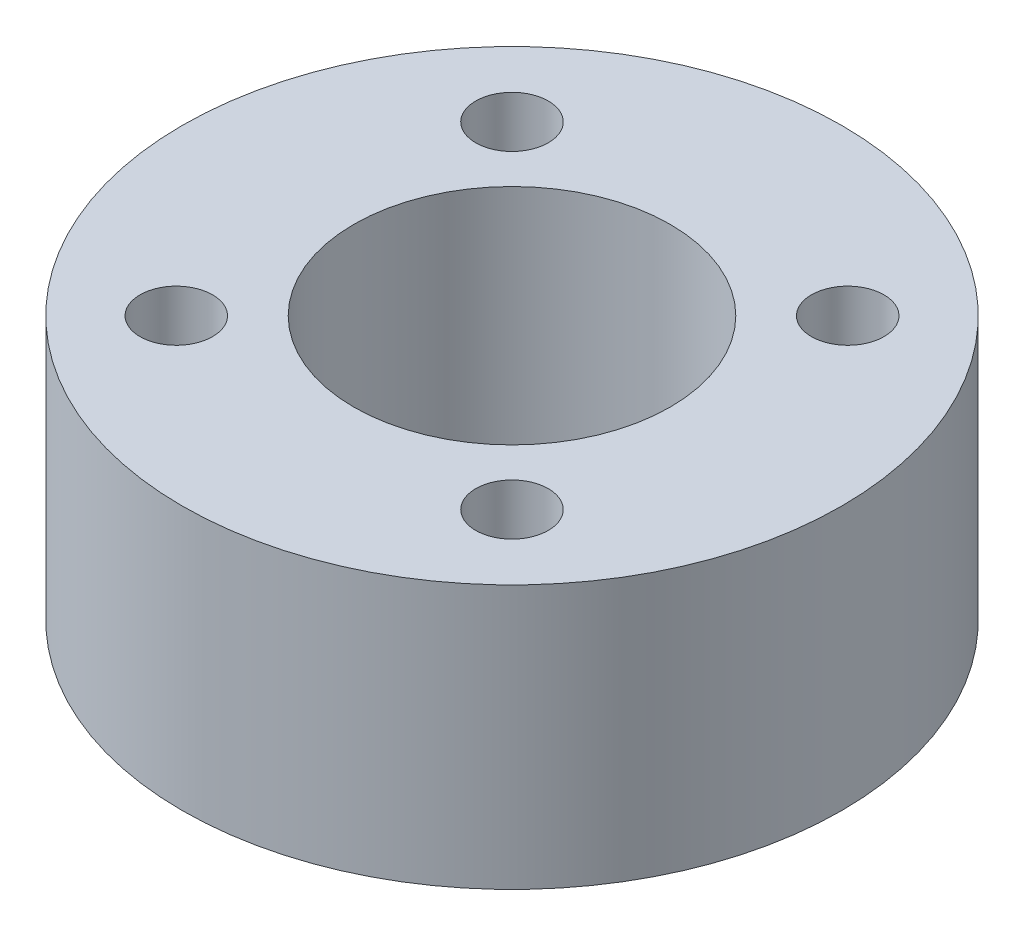
ISO-10303-21;
HEADER;
FILE_DESCRIPTION(('STEP AP214'),'2;1');
FILE_NAME('part.step','',(''),(''),'','','');
FILE_SCHEMA(('AUTOMOTIVE_DESIGN { 1 0 10303 214 1 1 1 1 }'));
ENDSEC;
DATA;
#1=APPLICATION_CONTEXT('core data for automotive mechanical design processes');
#2=APPLICATION_PROTOCOL_DEFINITION('international standard','automotive_design',2000,#1);
#3=PRODUCT_CONTEXT('',#1,'mechanical');
#4=PRODUCT('Part','Part','',(#3));
#5=PRODUCT_RELATED_PRODUCT_CATEGORY('part','',(#4));
#6=PRODUCT_DEFINITION_FORMATION('','',#4);
#7=PRODUCT_DEFINITION_CONTEXT('part definition',#1,'design');
#8=PRODUCT_DEFINITION('design','',#6,#7);
#9=PRODUCT_DEFINITION_SHAPE('','',#8);
#10=(LENGTH_UNIT() NAMED_UNIT(*) SI_UNIT(.MILLI.,.METRE.));
#11=(NAMED_UNIT(*) PLANE_ANGLE_UNIT() SI_UNIT($,.RADIAN.));
#12=(NAMED_UNIT(*) SI_UNIT($,.STERADIAN.) SOLID_ANGLE_UNIT());
#13=UNCERTAINTY_MEASURE_WITH_UNIT(LENGTH_MEASURE(1.E-05),#10,'distance_accuracy_value','');
#14=(GEOMETRIC_REPRESENTATION_CONTEXT(3) GLOBAL_UNCERTAINTY_ASSIGNED_CONTEXT((#13)) GLOBAL_UNIT_ASSIGNED_CONTEXT((#10,
#11,#12)) REPRESENTATION_CONTEXT('',''));
#15=CARTESIAN_POINT('',(0.,0.,0.));
#16=DIRECTION('',(0.,0.,1.));
#17=DIRECTION('',(1.,0.,0.));
#18=AXIS2_PLACEMENT_3D('',#15,#16,#17);
#19=CARTESIAN_POINT('',(0.,20.,0.));
#20=DIRECTION('',(0.,-1.,0.));
#21=DIRECTION('',(0.,0.,-1.));
#22=AXIS2_PLACEMENT_3D('',#19,#20,#21);
#23=CYLINDRICAL_SURFACE('',#22,25.);
#24=CARTESIAN_POINT('',(0.,20.,0.));
#25=DIRECTION('',(0.,1.,0.));
#26=DIRECTION('',(0.,0.,1.));
#27=AXIS2_PLACEMENT_3D('',#24,#25,#26);
#28=CIRCLE('',#27,25.);
#29=CARTESIAN_POINT('',(0.,20.,25.));
#30=VERTEX_POINT('',#29);
#31=EDGE_CURVE('E10',#30,#30,#28,.T.);
#32=ORIENTED_EDGE('',*,*,#31,.F.);
#33=EDGE_LOOP('',(#32));
#34=FACE_BOUND('',#33,.T.);
#35=CARTESIAN_POINT('',(0.,0.,0.));
#36=DIRECTION('',(0.,1.,0.));
#37=DIRECTION('',(0.,0.,1.));
#38=AXIS2_PLACEMENT_3D('',#35,#36,#37);
#39=CIRCLE('',#38,25.);
#40=CARTESIAN_POINT('',(0.,0.,25.));
#41=VERTEX_POINT('',#40);
#42=EDGE_CURVE('E42',#41,#41,#39,.T.);
#43=ORIENTED_EDGE('',*,*,#42,.T.);
#44=EDGE_LOOP('',(#43));
#45=FACE_BOUND('',#44,.T.);
#46=ADVANCED_FACE('F39',(#34,#45),#23,.T.);
#47=CARTESIAN_POINT('',(0.,20.,0.));
#48=DIRECTION('',(0.,1.,0.));
#49=DIRECTION('',(0.,0.,1.));
#50=AXIS2_PLACEMENT_3D('',#47,#48,#49);
#51=PLANE('',#50);
#52=CARTESIAN_POINT('',(-12.7279220613579,20.,12.7279220613579));
#53=DIRECTION('',(0.,-1.,0.));
#54=DIRECTION('',(0.,0.,-1.));
#55=AXIS2_PLACEMENT_3D('',#52,#53,#54);
#56=CIRCLE('',#55,2.75);
#57=CARTESIAN_POINT('',(-12.7279220613579,20.,9.97792206135786));
#58=VERTEX_POINT('',#57);
#59=EDGE_CURVE('E74',#58,#58,#56,.T.);
#60=ORIENTED_EDGE('',*,*,#59,.T.);
#61=EDGE_LOOP('',(#60));
#62=FACE_BOUND('',#61,.T.);
#63=CARTESIAN_POINT('',(12.7279220613579,20.,-12.7279220613579));
#64=DIRECTION('',(0.,-1.,0.));
#65=DIRECTION('',(0.,0.,-1.));
#66=AXIS2_PLACEMENT_3D('',#63,#64,#65);
#67=CIRCLE('',#66,2.75);
#68=CARTESIAN_POINT('',(12.7279220613579,20.,-15.4779220613579));
#69=VERTEX_POINT('',#68);
#70=EDGE_CURVE('E68',#69,#69,#67,.T.);
#71=ORIENTED_EDGE('',*,*,#70,.T.);
#72=EDGE_LOOP('',(#71));
#73=FACE_BOUND('',#72,.T.);
#74=CARTESIAN_POINT('',(-12.7279220613579,20.,-12.7279220613579));
#75=DIRECTION('',(0.,-1.,0.));
#76=DIRECTION('',(0.,0.,-1.));
#77=AXIS2_PLACEMENT_3D('',#74,#75,#76);
#78=CIRCLE('',#77,2.75);
#79=CARTESIAN_POINT('',(-12.7279220613579,20.,-15.4779220613579));
#80=VERTEX_POINT('',#79);
#81=EDGE_CURVE('E62',#80,#80,#78,.T.);
#82=ORIENTED_EDGE('',*,*,#81,.T.);
#83=EDGE_LOOP('',(#82));
#84=FACE_BOUND('',#83,.T.);
#85=CARTESIAN_POINT('',(12.7279220613579,20.,12.7279220613579));
#86=DIRECTION('',(0.,-1.,0.));
#87=DIRECTION('',(0.,0.,-1.));
#88=AXIS2_PLACEMENT_3D('',#85,#86,#87);
#89=CIRCLE('',#88,2.75);
#90=CARTESIAN_POINT('',(12.7279220613579,20.,9.97792206135786));
#91=VERTEX_POINT('',#90);
#92=EDGE_CURVE('E54',#91,#91,#89,.T.);
#93=ORIENTED_EDGE('',*,*,#92,.T.);
#94=EDGE_LOOP('',(#93));
#95=FACE_BOUND('',#94,.T.);
#96=CARTESIAN_POINT('',(0.,20.,0.));
#97=DIRECTION('',(0.,1.,0.));
#98=DIRECTION('',(0.,0.,1.));
#99=AXIS2_PLACEMENT_3D('',#96,#97,#98);
#100=CIRCLE('',#99,12.);
#101=CARTESIAN_POINT('',(0.,20.,12.));
#102=VERTEX_POINT('',#101);
#103=EDGE_CURVE('E51',#102,#102,#100,.T.);
#104=ORIENTED_EDGE('',*,*,#103,.F.);
#105=EDGE_LOOP('',(#104));
#106=FACE_BOUND('',#105,.T.);
#107=ORIENTED_EDGE('',*,*,#31,.T.);
#108=EDGE_LOOP('',(#107));
#109=FACE_BOUND('',#108,.T.);
#110=ADVANCED_FACE('F87',(#62,#73,#84,#95,#106,#109),#51,.T.);
#111=CARTESIAN_POINT('',(0.,0.,0.));
#112=DIRECTION('',(0.,1.,0.));
#113=DIRECTION('',(0.,0.,1.));
#114=AXIS2_PLACEMENT_3D('',#111,#112,#113);
#115=PLANE('',#114);
#116=CARTESIAN_POINT('',(-12.7279220613579,0.,12.7279220613579));
#117=DIRECTION('',(0.,-1.,0.));
#118=DIRECTION('',(0.,0.,-1.));
#119=AXIS2_PLACEMENT_3D('',#116,#117,#118);
#120=CIRCLE('',#119,2.75);
#121=CARTESIAN_POINT('',(-12.7279220613579,0.,9.97792206135786));
#122=VERTEX_POINT('',#121);
#123=EDGE_CURVE('E77',#122,#122,#120,.T.);
#124=ORIENTED_EDGE('',*,*,#123,.F.);
#125=EDGE_LOOP('',(#124));
#126=FACE_BOUND('',#125,.T.);
#127=CARTESIAN_POINT('',(12.7279220613579,0.,-12.7279220613579));
#128=DIRECTION('',(0.,-1.,0.));
#129=DIRECTION('',(0.,0.,-1.));
#130=AXIS2_PLACEMENT_3D('',#127,#128,#129);
#131=CIRCLE('',#130,2.75);
#132=CARTESIAN_POINT('',(12.7279220613579,0.,-15.4779220613579));
#133=VERTEX_POINT('',#132);
#134=EDGE_CURVE('E71',#133,#133,#131,.T.);
#135=ORIENTED_EDGE('',*,*,#134,.F.);
#136=EDGE_LOOP('',(#135));
#137=FACE_BOUND('',#136,.T.);
#138=CARTESIAN_POINT('',(-12.7279220613579,0.,-12.7279220613579));
#139=DIRECTION('',(0.,-1.,0.));
#140=DIRECTION('',(0.,0.,-1.));
#141=AXIS2_PLACEMENT_3D('',#138,#139,#140);
#142=CIRCLE('',#141,2.75);
#143=CARTESIAN_POINT('',(-12.7279220613579,0.,-15.4779220613579));
#144=VERTEX_POINT('',#143);
#145=EDGE_CURVE('E65',#144,#144,#142,.T.);
#146=ORIENTED_EDGE('',*,*,#145,.F.);
#147=EDGE_LOOP('',(#146));
#148=FACE_BOUND('',#147,.T.);
#149=CARTESIAN_POINT('',(12.7279220613579,0.,12.7279220613579));
#150=DIRECTION('',(0.,-1.,0.));
#151=DIRECTION('',(0.,0.,-1.));
#152=AXIS2_PLACEMENT_3D('',#149,#150,#151);
#153=CIRCLE('',#152,2.75);
#154=CARTESIAN_POINT('',(12.7279220613579,0.,9.97792206135786));
#155=VERTEX_POINT('',#154);
#156=EDGE_CURVE('E59',#155,#155,#153,.T.);
#157=ORIENTED_EDGE('',*,*,#156,.F.);
#158=EDGE_LOOP('',(#157));
#159=FACE_BOUND('',#158,.T.);
#160=CARTESIAN_POINT('',(0.,0.,0.));
#161=DIRECTION('',(0.,1.,0.));
#162=DIRECTION('',(0.,0.,1.));
#163=AXIS2_PLACEMENT_3D('',#160,#161,#162);
#164=CIRCLE('',#163,12.);
#165=CARTESIAN_POINT('',(0.,0.,12.));
#166=VERTEX_POINT('',#165);
#167=EDGE_CURVE('E49',#166,#166,#164,.T.);
#168=ORIENTED_EDGE('',*,*,#167,.T.);
#169=EDGE_LOOP('',(#168));
#170=FACE_BOUND('',#169,.T.);
#171=ORIENTED_EDGE('',*,*,#42,.F.);
#172=EDGE_LOOP('',(#171));
#173=FACE_BOUND('',#172,.T.);
#174=ADVANCED_FACE('F83',(#126,#137,#148,#159,#170,#173),#115,.F.);
#175=CARTESIAN_POINT('',(0.,0.,0.));
#176=DIRECTION('',(0.,1.,0.));
#177=DIRECTION('',(0.,0.,1.));
#178=AXIS2_PLACEMENT_3D('',#175,#176,#177);
#179=CYLINDRICAL_SURFACE('',#178,12.);
#180=ORIENTED_EDGE('',*,*,#167,.F.);
#181=EDGE_LOOP('',(#180));
#182=FACE_BOUND('',#181,.T.);
#183=ORIENTED_EDGE('',*,*,#103,.T.);
#184=EDGE_LOOP('',(#183));
#185=FACE_BOUND('',#184,.T.);
#186=ADVANCED_FACE('F86',(#182,#185),#179,.F.);
#187=CARTESIAN_POINT('',(12.7279220613579,0.,12.7279220613579));
#188=DIRECTION('',(0.,-1.,0.));
#189=DIRECTION('',(0.,0.,-1.));
#190=AXIS2_PLACEMENT_3D('',#187,#188,#189);
#191=CYLINDRICAL_SURFACE('',#190,2.75);
#192=ORIENTED_EDGE('',*,*,#92,.F.);
#193=EDGE_LOOP('',(#192));
#194=FACE_BOUND('',#193,.T.);
#195=ORIENTED_EDGE('',*,*,#156,.T.);
#196=EDGE_LOOP('',(#195));
#197=FACE_BOUND('',#196,.T.);
#198=ADVANCED_FACE('F111',(#194,#197),#191,.F.);
#199=CARTESIAN_POINT('',(-12.7279220613579,0.,-12.7279220613579));
#200=DIRECTION('',(0.,-1.,0.));
#201=DIRECTION('',(0.,0.,-1.));
#202=AXIS2_PLACEMENT_3D('',#199,#200,#201);
#203=CYLINDRICAL_SURFACE('',#202,2.75);
#204=ORIENTED_EDGE('',*,*,#81,.F.);
#205=EDGE_LOOP('',(#204));
#206=FACE_BOUND('',#205,.T.);
#207=ORIENTED_EDGE('',*,*,#145,.T.);
#208=EDGE_LOOP('',(#207));
#209=FACE_BOUND('',#208,.T.);
#210=ADVANCED_FACE('F115',(#206,#209),#203,.F.);
#211=CARTESIAN_POINT('',(12.7279220613579,0.,-12.7279220613579));
#212=DIRECTION('',(0.,-1.,0.));
#213=DIRECTION('',(0.,0.,-1.));
#214=AXIS2_PLACEMENT_3D('',#211,#212,#213);
#215=CYLINDRICAL_SURFACE('',#214,2.75);
#216=ORIENTED_EDGE('',*,*,#70,.F.);
#217=EDGE_LOOP('',(#216));
#218=FACE_BOUND('',#217,.T.);
#219=ORIENTED_EDGE('',*,*,#134,.T.);
#220=EDGE_LOOP('',(#219));
#221=FACE_BOUND('',#220,.T.);
#222=ADVANCED_FACE('F119',(#218,#221),#215,.F.);
#223=CARTESIAN_POINT('',(-12.7279220613579,0.,12.7279220613579));
#224=DIRECTION('',(0.,-1.,0.));
#225=DIRECTION('',(0.,0.,-1.));
#226=AXIS2_PLACEMENT_3D('',#223,#224,#225);
#227=CYLINDRICAL_SURFACE('',#226,2.75);
#228=ORIENTED_EDGE('',*,*,#59,.F.);
#229=EDGE_LOOP('',(#228));
#230=FACE_BOUND('',#229,.T.);
#231=ORIENTED_EDGE('',*,*,#123,.T.);
#232=EDGE_LOOP('',(#231));
#233=FACE_BOUND('',#232,.T.);
#234=ADVANCED_FACE('F81',(#230,#233),#227,.F.);
#235=CLOSED_SHELL('',(#46,#110,#174,#186,#198,#210,#222,#234));
#236=MANIFOLD_SOLID_BREP('B2',#235);
#237=ADVANCED_BREP_SHAPE_REPRESENTATION('',(#18,#236),#14);
#238=SHAPE_DEFINITION_REPRESENTATION(#9,#237);
ENDSEC;
END-ISO-10303-21;
